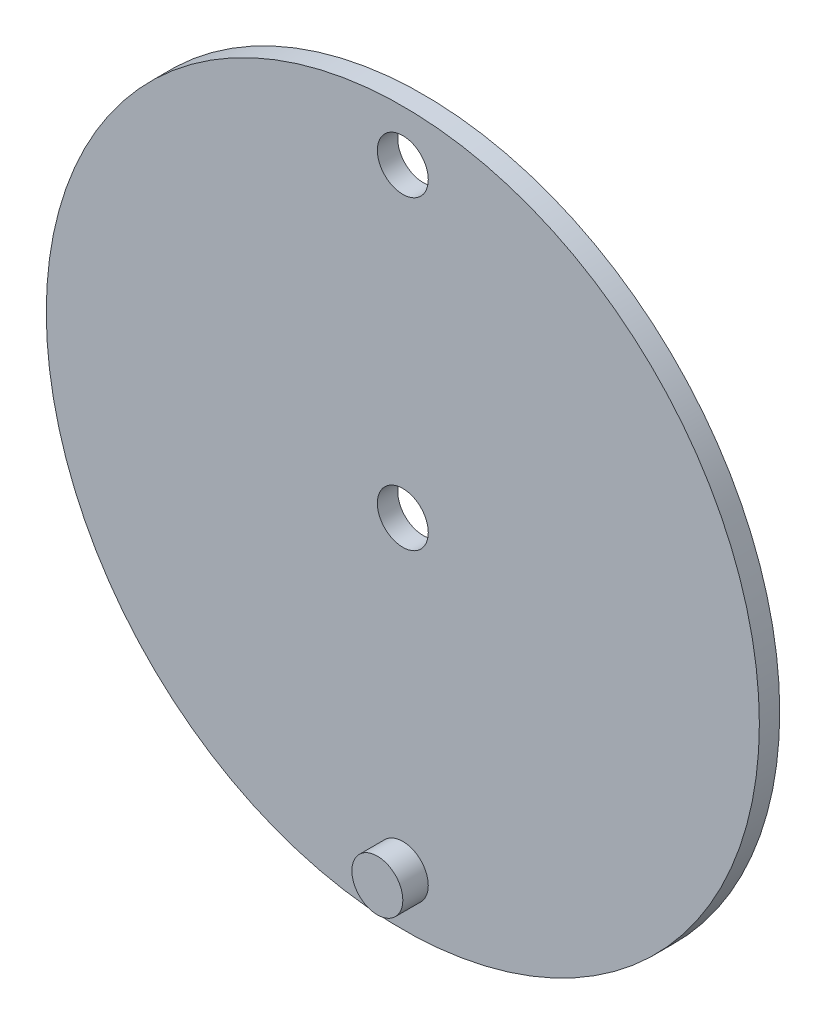
ISO-10303-21;
HEADER;
FILE_DESCRIPTION(('STEP AP214'),'2;1');
FILE_NAME('part.step','',(''),(''),'','','');
FILE_SCHEMA(('AUTOMOTIVE_DESIGN { 1 0 10303 214 1 1 1 1 }'));
ENDSEC;
DATA;
#1=APPLICATION_CONTEXT('core data for automotive mechanical design processes');
#2=APPLICATION_PROTOCOL_DEFINITION('international standard','automotive_design',2000,#1);
#3=PRODUCT_CONTEXT('',#1,'mechanical');
#4=PRODUCT('Part','Part','',(#3));
#5=PRODUCT_RELATED_PRODUCT_CATEGORY('part','',(#4));
#6=PRODUCT_DEFINITION_FORMATION('','',#4);
#7=PRODUCT_DEFINITION_CONTEXT('part definition',#1,'design');
#8=PRODUCT_DEFINITION('design','',#6,#7);
#9=PRODUCT_DEFINITION_SHAPE('','',#8);
#10=(LENGTH_UNIT() NAMED_UNIT(*) SI_UNIT(.MILLI.,.METRE.));
#11=(NAMED_UNIT(*) PLANE_ANGLE_UNIT() SI_UNIT($,.RADIAN.));
#12=(NAMED_UNIT(*) SI_UNIT($,.STERADIAN.) SOLID_ANGLE_UNIT());
#13=UNCERTAINTY_MEASURE_WITH_UNIT(LENGTH_MEASURE(1.E-05),#10,'distance_accuracy_value','');
#14=(GEOMETRIC_REPRESENTATION_CONTEXT(3) GLOBAL_UNCERTAINTY_ASSIGNED_CONTEXT((#13)) GLOBAL_UNIT_ASSIGNED_CONTEXT((#10,
#11,#12)) REPRESENTATION_CONTEXT('',''));
#15=CARTESIAN_POINT('',(0.,0.,0.));
#16=DIRECTION('',(0.,0.,1.));
#17=DIRECTION('',(1.,0.,0.));
#18=AXIS2_PLACEMENT_3D('',#15,#16,#17);
#19=CARTESIAN_POINT('',(0.,0.,5.08));
#20=DIRECTION('',(0.,0.,1.));
#21=DIRECTION('',(1.,0.,0.));
#22=AXIS2_PLACEMENT_3D('',#19,#20,#21);
#23=PLANE('',#22);
#24=CARTESIAN_POINT('',(0.,-76.2,5.08));
#25=DIRECTION('',(0.,0.,1.));
#26=DIRECTION('',(1.,0.,0.));
#27=AXIS2_PLACEMENT_3D('',#24,#25,#26);
#28=CIRCLE('',#27,6.35);
#29=CARTESIAN_POINT('',(6.35,-76.2,5.08));
#30=VERTEX_POINT('',#29);
#31=EDGE_CURVE('E60',#30,#30,#28,.T.);
#32=ORIENTED_EDGE('',*,*,#31,.F.);
#33=EDGE_LOOP('',(#32));
#34=FACE_BOUND('',#33,.T.);
#35=CARTESIAN_POINT('',(0.,0.,5.08));
#36=DIRECTION('',(0.,0.,1.));
#37=DIRECTION('',(1.,0.,0.));
#38=AXIS2_PLACEMENT_3D('',#35,#36,#37);
#39=CIRCLE('',#38,88.9);
#40=CARTESIAN_POINT('',(88.9,0.,5.08));
#41=VERTEX_POINT('',#40);
#42=EDGE_CURVE('E10',#41,#41,#39,.T.);
#43=ORIENTED_EDGE('',*,*,#42,.T.);
#44=EDGE_LOOP('',(#43));
#45=FACE_BOUND('',#44,.T.);
#46=CARTESIAN_POINT('',(0.,0.,5.08));
#47=DIRECTION('',(0.,0.,1.));
#48=DIRECTION('',(1.,0.,0.));
#49=AXIS2_PLACEMENT_3D('',#46,#47,#48);
#50=CIRCLE('',#49,6.35);
#51=CARTESIAN_POINT('',(6.35,0.,5.08));
#52=VERTEX_POINT('',#51);
#53=EDGE_CURVE('E54',#52,#52,#50,.T.);
#54=ORIENTED_EDGE('',*,*,#53,.F.);
#55=EDGE_LOOP('',(#54));
#56=FACE_BOUND('',#55,.T.);
#57=CARTESIAN_POINT('',(0.,76.2,5.08));
#58=DIRECTION('',(0.,0.,1.));
#59=DIRECTION('',(1.,0.,0.));
#60=AXIS2_PLACEMENT_3D('',#57,#58,#59);
#61=CIRCLE('',#60,6.35);
#62=CARTESIAN_POINT('',(6.35,76.2,5.08));
#63=VERTEX_POINT('',#62);
#64=EDGE_CURVE('E67',#63,#63,#61,.T.);
#65=ORIENTED_EDGE('',*,*,#64,.F.);
#66=EDGE_LOOP('',(#65));
#67=FACE_BOUND('',#66,.T.);
#68=ADVANCED_FACE('F41',(#34,#45,#56,#67),#23,.T.);
#69=CARTESIAN_POINT('',(0.,0.,0.));
#70=DIRECTION('',(0.,0.,1.));
#71=DIRECTION('',(1.,0.,0.));
#72=AXIS2_PLACEMENT_3D('',#69,#70,#71);
#73=PLANE('',#72);
#74=CARTESIAN_POINT('',(0.,0.,0.));
#75=DIRECTION('',(0.,0.,1.));
#76=DIRECTION('',(1.,0.,0.));
#77=AXIS2_PLACEMENT_3D('',#74,#75,#76);
#78=CIRCLE('',#77,88.9);
#79=CARTESIAN_POINT('',(88.9,0.,0.));
#80=VERTEX_POINT('',#79);
#81=EDGE_CURVE('E45',#80,#80,#78,.T.);
#82=ORIENTED_EDGE('',*,*,#81,.F.);
#83=EDGE_LOOP('',(#82));
#84=FACE_BOUND('',#83,.T.);
#85=CARTESIAN_POINT('',(0.,0.,0.));
#86=DIRECTION('',(0.,0.,1.));
#87=DIRECTION('',(1.,0.,0.));
#88=AXIS2_PLACEMENT_3D('',#85,#86,#87);
#89=CIRCLE('',#88,6.35);
#90=CARTESIAN_POINT('',(6.35,0.,0.));
#91=VERTEX_POINT('',#90);
#92=EDGE_CURVE('E56',#91,#91,#89,.T.);
#93=ORIENTED_EDGE('',*,*,#92,.T.);
#94=EDGE_LOOP('',(#93));
#95=FACE_BOUND('',#94,.T.);
#96=CARTESIAN_POINT('',(0.,76.2,0.));
#97=DIRECTION('',(0.,0.,1.));
#98=DIRECTION('',(1.,0.,0.));
#99=AXIS2_PLACEMENT_3D('',#96,#97,#98);
#100=CIRCLE('',#99,6.35);
#101=CARTESIAN_POINT('',(6.35,76.2,0.));
#102=VERTEX_POINT('',#101);
#103=EDGE_CURVE('E68',#102,#102,#100,.T.);
#104=ORIENTED_EDGE('',*,*,#103,.T.);
#105=EDGE_LOOP('',(#104));
#106=FACE_BOUND('',#105,.T.);
#107=ADVANCED_FACE('F96',(#84,#95,#106),#73,.F.);
#108=CARTESIAN_POINT('',(0.,0.,5.08));
#109=DIRECTION('',(0.,0.,-1.));
#110=DIRECTION('',(-1.,0.,0.));
#111=AXIS2_PLACEMENT_3D('',#108,#109,#110);
#112=CYLINDRICAL_SURFACE('',#111,88.9);
#113=ORIENTED_EDGE('',*,*,#42,.F.);
#114=EDGE_LOOP('',(#113));
#115=FACE_BOUND('',#114,.T.);
#116=ORIENTED_EDGE('',*,*,#81,.T.);
#117=EDGE_LOOP('',(#116));
#118=FACE_BOUND('',#117,.T.);
#119=ADVANCED_FACE('F43',(#115,#118),#112,.T.);
#120=CARTESIAN_POINT('',(0.,0.,5.08));
#121=DIRECTION('',(0.,0.,-1.));
#122=DIRECTION('',(-1.,0.,0.));
#123=AXIS2_PLACEMENT_3D('',#120,#121,#122);
#124=CYLINDRICAL_SURFACE('',#123,6.35);
#125=ORIENTED_EDGE('',*,*,#53,.T.);
#126=EDGE_LOOP('',(#125));
#127=FACE_BOUND('',#126,.T.);
#128=ORIENTED_EDGE('',*,*,#92,.F.);
#129=EDGE_LOOP('',(#128));
#130=FACE_BOUND('',#129,.T.);
#131=ADVANCED_FACE('F92',(#127,#130),#124,.F.);
#132=CARTESIAN_POINT('',(0.,76.2,5.08));
#133=DIRECTION('',(0.,0.,-1.));
#134=DIRECTION('',(-1.,0.,0.));
#135=AXIS2_PLACEMENT_3D('',#132,#133,#134);
#136=CYLINDRICAL_SURFACE('',#135,6.35);
#137=ORIENTED_EDGE('',*,*,#64,.T.);
#138=EDGE_LOOP('',(#137));
#139=FACE_BOUND('',#138,.T.);
#140=ORIENTED_EDGE('',*,*,#103,.F.);
#141=EDGE_LOOP('',(#140));
#142=FACE_BOUND('',#141,.T.);
#143=ADVANCED_FACE('F84',(#139,#142),#136,.F.);
#144=CARTESIAN_POINT('',(0.,-76.2,11.43));
#145=DIRECTION('',(0.,0.,-1.));
#146=DIRECTION('',(-1.,0.,0.));
#147=AXIS2_PLACEMENT_3D('',#144,#145,#146);
#148=CYLINDRICAL_SURFACE('',#147,6.35);
#149=ORIENTED_EDGE('',*,*,#31,.T.);
#150=EDGE_LOOP('',(#149));
#151=FACE_BOUND('',#150,.T.);
#152=CARTESIAN_POINT('',(0.,-76.2,11.43));
#153=DIRECTION('',(0.,0.,1.));
#154=DIRECTION('',(1.,0.,0.));
#155=AXIS2_PLACEMENT_3D('',#152,#153,#154);
#156=CIRCLE('',#155,6.35);
#157=CARTESIAN_POINT('',(6.35,-76.2,11.43));
#158=VERTEX_POINT('',#157);
#159=EDGE_CURVE('E72',#158,#158,#156,.T.);
#160=ORIENTED_EDGE('',*,*,#159,.F.);
#161=EDGE_LOOP('',(#160));
#162=FACE_BOUND('',#161,.T.);
#163=ADVANCED_FACE('F82',(#151,#162),#148,.T.);
#164=CARTESIAN_POINT('',(0.,-76.2,11.43));
#165=DIRECTION('',(0.,0.,1.));
#166=DIRECTION('',(1.,0.,0.));
#167=AXIS2_PLACEMENT_3D('',#164,#165,#166);
#168=PLANE('',#167);
#169=ORIENTED_EDGE('',*,*,#159,.T.);
#170=EDGE_LOOP('',(#169));
#171=FACE_BOUND('',#170,.T.);
#172=ADVANCED_FACE('F80',(#171),#168,.T.);
#173=CLOSED_SHELL('',(#68,#107,#119,#131,#143,#163,#172));
#174=MANIFOLD_SOLID_BREP('B2',#173);
#175=ADVANCED_BREP_SHAPE_REPRESENTATION('',(#18,#174),#14);
#176=SHAPE_DEFINITION_REPRESENTATION(#9,#175);
ENDSEC;
END-ISO-10303-21;
